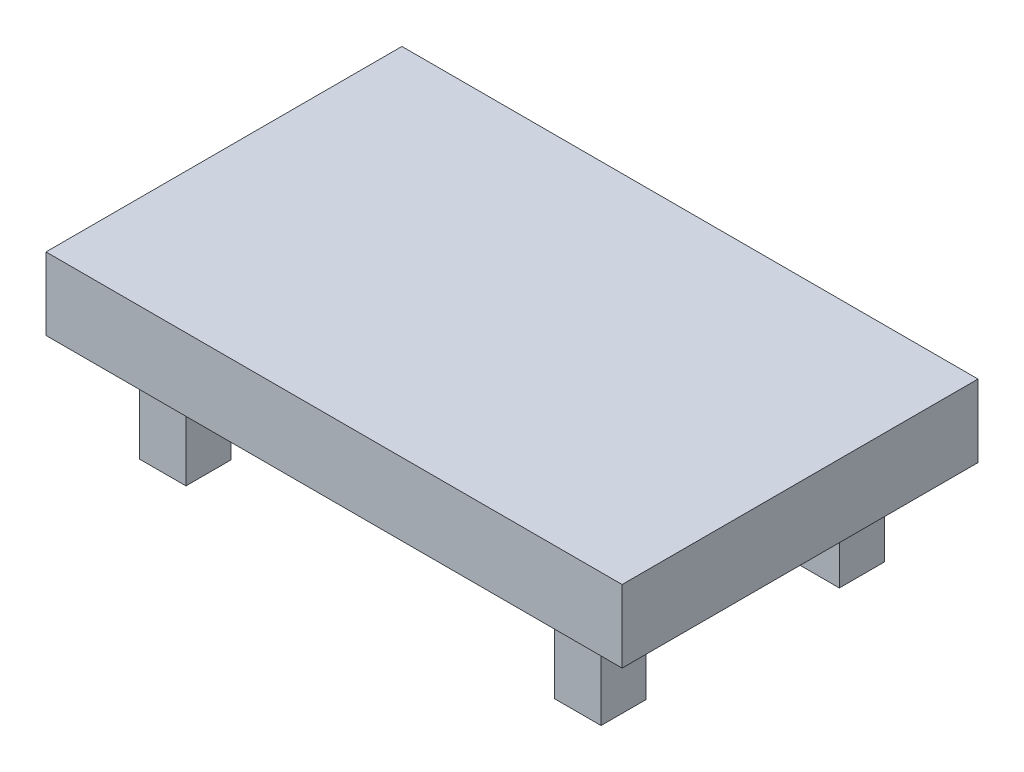
ISO-10303-21;
HEADER;
FILE_DESCRIPTION(('STEP AP214'),'2;1');
FILE_NAME('part.step','',(''),(''),'','','');
FILE_SCHEMA(('AUTOMOTIVE_DESIGN { 1 0 10303 214 1 1 1 1 }'));
ENDSEC;
DATA;
#1=APPLICATION_CONTEXT('core data for automotive mechanical design processes');
#2=APPLICATION_PROTOCOL_DEFINITION('international standard','automotive_design',2000,#1);
#3=PRODUCT_CONTEXT('',#1,'mechanical');
#4=PRODUCT('Part','Part','',(#3));
#5=PRODUCT_RELATED_PRODUCT_CATEGORY('part','',(#4));
#6=PRODUCT_DEFINITION_FORMATION('','',#4);
#7=PRODUCT_DEFINITION_CONTEXT('part definition',#1,'design');
#8=PRODUCT_DEFINITION('design','',#6,#7);
#9=PRODUCT_DEFINITION_SHAPE('','',#8);
#10=(LENGTH_UNIT() NAMED_UNIT(*) SI_UNIT(.MILLI.,.METRE.));
#11=(NAMED_UNIT(*) PLANE_ANGLE_UNIT() SI_UNIT($,.RADIAN.));
#12=(NAMED_UNIT(*) SI_UNIT($,.STERADIAN.) SOLID_ANGLE_UNIT());
#13=UNCERTAINTY_MEASURE_WITH_UNIT(LENGTH_MEASURE(1.E-05),#10,'distance_accuracy_value','');
#14=(GEOMETRIC_REPRESENTATION_CONTEXT(3) GLOBAL_UNCERTAINTY_ASSIGNED_CONTEXT((#13)) GLOBAL_UNIT_ASSIGNED_CONTEXT((#10,
#11,#12)) REPRESENTATION_CONTEXT('',''));
#15=CARTESIAN_POINT('',(0.,0.,0.));
#16=DIRECTION('',(0.,0.,1.));
#17=DIRECTION('',(1.,0.,0.));
#18=AXIS2_PLACEMENT_3D('',#15,#16,#17);
#19=CARTESIAN_POINT('',(-1212.85,0.,749.3));
#20=DIRECTION('',(0.,1.,0.));
#21=DIRECTION('',(0.,0.,1.));
#22=AXIS2_PLACEMENT_3D('',#19,#20,#21);
#23=PLANE('',#22);
#24=DIRECTION('',(1.,0.,0.));
#25=VECTOR('',#24,1.);
#26=CARTESIAN_POINT('',(-971.744914866313,0.,-596.811642704917));
#27=LINE('',#26,#25);
#28=CARTESIAN_POINT('',(-971.744914866313,0.,-596.811642704917));
#29=VERTEX_POINT('',#28);
#30=CARTESIAN_POINT('',(-776.047224743795,0.,-596.811642704917));
#31=VERTEX_POINT('',#30);
#32=EDGE_CURVE('E191',#29,#31,#27,.T.);
#33=ORIENTED_EDGE('',*,*,#32,.F.);
#34=DIRECTION('',(0.,0.,-1.));
#35=VECTOR('',#34,1.);
#36=CARTESIAN_POINT('',(-971.744914866313,0.,-596.811642704917));
#37=LINE('',#36,#35);
#38=CARTESIAN_POINT('',(-971.744914866313,0.,-406.610663860747));
#39=VERTEX_POINT('',#38);
#40=EDGE_CURVE('E204',#39,#29,#37,.T.);
#41=ORIENTED_EDGE('',*,*,#40,.F.);
#42=DIRECTION('',(-1.,0.,0.));
#43=VECTOR('',#42,1.);
#44=CARTESIAN_POINT('',(-971.744914866313,0.,-406.610663860747));
#45=LINE('',#44,#43);
#46=CARTESIAN_POINT('',(-776.047224743795,0.,-406.610663860748));
#47=VERTEX_POINT('',#46);
#48=EDGE_CURVE('E213',#47,#39,#45,.T.);
#49=ORIENTED_EDGE('',*,*,#48,.F.);
#50=DIRECTION('',(0.,0.,1.));
#51=VECTOR('',#50,1.);
#52=CARTESIAN_POINT('',(-776.047224743795,0.,-596.811642704917));
#53=LINE('',#52,#51);
#54=EDGE_CURVE('E194',#31,#47,#53,.T.);
#55=ORIENTED_EDGE('',*,*,#54,.F.);
#56=EDGE_LOOP('',(#33,#41,#49,#55));
#57=FACE_BOUND('',#56,.T.);
#58=DIRECTION('',(0.,0.,-1.));
#59=VECTOR('',#58,1.);
#60=CARTESIAN_POINT('',(-971.744914866313,0.,596.811642704916));
#61=LINE('',#60,#59);
#62=CARTESIAN_POINT('',(-971.744914866313,0.,596.811642704916));
#63=VERTEX_POINT('',#62);
#64=CARTESIAN_POINT('',(-971.744914866313,0.,406.610663860747));
#65=VERTEX_POINT('',#64);
#66=EDGE_CURVE('E262',#63,#65,#61,.T.);
#67=ORIENTED_EDGE('',*,*,#66,.F.);
#68=DIRECTION('',(-1.,0.,0.));
#69=VECTOR('',#68,1.);
#70=CARTESIAN_POINT('',(-971.744914866313,0.,596.811642704916));
#71=LINE('',#70,#69);
#72=CARTESIAN_POINT('',(-776.047224743795,0.,596.811642704916));
#73=VERTEX_POINT('',#72);
#74=EDGE_CURVE('E267',#73,#63,#71,.T.);
#75=ORIENTED_EDGE('',*,*,#74,.F.);
#76=DIRECTION('',(0.,0.,1.));
#77=VECTOR('',#76,1.);
#78=CARTESIAN_POINT('',(-776.047224743795,0.,596.811642704916));
#79=LINE('',#78,#77);
#80=CARTESIAN_POINT('',(-776.047224743795,0.,406.610663860747));
#81=VERTEX_POINT('',#80);
#82=EDGE_CURVE('E279',#81,#73,#79,.T.);
#83=ORIENTED_EDGE('',*,*,#82,.F.);
#84=DIRECTION('',(1.,0.,0.));
#85=VECTOR('',#84,1.);
#86=CARTESIAN_POINT('',(-971.744914866313,0.,406.610663860747));
#87=LINE('',#86,#85);
#88=EDGE_CURVE('E276',#65,#81,#87,.T.);
#89=ORIENTED_EDGE('',*,*,#88,.F.);
#90=EDGE_LOOP('',(#67,#75,#83,#89));
#91=FACE_BOUND('',#90,.T.);
#92=DIRECTION('',(0.,0.,1.));
#93=VECTOR('',#92,1.);
#94=CARTESIAN_POINT('',(-1212.85,0.,-749.3));
#95=LINE('',#94,#93);
#96=CARTESIAN_POINT('',(-1212.85,0.,-749.3));
#97=VERTEX_POINT('',#96);
#98=CARTESIAN_POINT('',(-1212.85,0.,749.3));
#99=VERTEX_POINT('',#98);
#100=EDGE_CURVE('E295',#97,#99,#95,.T.);
#101=ORIENTED_EDGE('',*,*,#100,.F.);
#102=DIRECTION('',(-1.,0.,0.));
#103=VECTOR('',#102,1.);
#104=CARTESIAN_POINT('',(-1212.85,0.,-749.3));
#105=LINE('',#104,#103);
#106=CARTESIAN_POINT('',(1212.85,0.,-749.3));
#107=VERTEX_POINT('',#106);
#108=EDGE_CURVE('E300',#107,#97,#105,.T.);
#109=ORIENTED_EDGE('',*,*,#108,.F.);
#110=DIRECTION('',(0.,0.,-1.));
#111=VECTOR('',#110,1.);
#112=CARTESIAN_POINT('',(1212.85,0.,-749.3));
#113=LINE('',#112,#111);
#114=CARTESIAN_POINT('',(1212.85,0.,749.3));
#115=VERTEX_POINT('',#114);
#116=EDGE_CURVE('E311',#115,#107,#113,.T.);
#117=ORIENTED_EDGE('',*,*,#116,.F.);
#118=DIRECTION('',(1.,0.,0.));
#119=VECTOR('',#118,1.);
#120=CARTESIAN_POINT('',(-1212.85,0.,749.3));
#121=LINE('',#120,#119);
#122=EDGE_CURVE('E309',#99,#115,#121,.T.);
#123=ORIENTED_EDGE('',*,*,#122,.F.);
#124=EDGE_LOOP('',(#101,#109,#117,#123));
#125=FACE_BOUND('',#124,.T.);
#126=DIRECTION('',(-1.,0.,0.));
#127=VECTOR('',#126,1.);
#128=CARTESIAN_POINT('',(971.744914866313,0.,596.811642704916));
#129=LINE('',#128,#127);
#130=CARTESIAN_POINT('',(971.744914866313,0.,596.811642704916));
#131=VERTEX_POINT('',#130);
#132=CARTESIAN_POINT('',(776.047224743795,0.,596.811642704916));
#133=VERTEX_POINT('',#132);
#134=EDGE_CURVE('E229',#131,#133,#129,.T.);
#135=ORIENTED_EDGE('',*,*,#134,.F.);
#136=DIRECTION('',(0.,0.,1.));
#137=VECTOR('',#136,1.);
#138=CARTESIAN_POINT('',(971.744914866313,0.,596.811642704916));
#139=LINE('',#138,#137);
#140=CARTESIAN_POINT('',(971.744914866314,0.,406.610663860747));
#141=VERTEX_POINT('',#140);
#142=EDGE_CURVE('E234',#141,#131,#139,.T.);
#143=ORIENTED_EDGE('',*,*,#142,.F.);
#144=DIRECTION('',(1.,0.,0.));
#145=VECTOR('',#144,1.);
#146=CARTESIAN_POINT('',(971.744914866314,0.,406.610663860747));
#147=LINE('',#146,#145);
#148=CARTESIAN_POINT('',(776.047224743795,0.,406.610663860747));
#149=VERTEX_POINT('',#148);
#150=EDGE_CURVE('E246',#149,#141,#147,.T.);
#151=ORIENTED_EDGE('',*,*,#150,.F.);
#152=DIRECTION('',(0.,0.,-1.));
#153=VECTOR('',#152,1.);
#154=CARTESIAN_POINT('',(776.047224743795,0.,596.811642704916));
#155=LINE('',#154,#153);
#156=EDGE_CURVE('E243',#133,#149,#155,.T.);
#157=ORIENTED_EDGE('',*,*,#156,.F.);
#158=EDGE_LOOP('',(#135,#143,#151,#157));
#159=FACE_BOUND('',#158,.T.);
#160=DIRECTION('',(0.,0.,1.));
#161=VECTOR('',#160,1.);
#162=CARTESIAN_POINT('',(971.744914866313,0.,-596.811642704917));
#163=LINE('',#162,#161);
#164=CARTESIAN_POINT('',(971.744914866313,0.,-596.811642704917));
#165=VERTEX_POINT('',#164);
#166=CARTESIAN_POINT('',(971.744914866313,0.,-406.610663860747));
#167=VERTEX_POINT('',#166);
#168=EDGE_CURVE('E190',#165,#167,#163,.T.);
#169=ORIENTED_EDGE('',*,*,#168,.F.);
#170=DIRECTION('',(1.,0.,0.));
#171=VECTOR('',#170,1.);
#172=CARTESIAN_POINT('',(971.744914866313,0.,-596.811642704917));
#173=LINE('',#172,#171);
#174=CARTESIAN_POINT('',(776.047224743795,0.,-596.811642704917));
#175=VERTEX_POINT('',#174);
#176=EDGE_CURVE('E187',#175,#165,#173,.T.);
#177=ORIENTED_EDGE('',*,*,#176,.F.);
#178=DIRECTION('',(0.,0.,-1.));
#179=VECTOR('',#178,1.);
#180=CARTESIAN_POINT('',(776.047224743795,0.,-596.811642704917));
#181=LINE('',#180,#179);
#182=CARTESIAN_POINT('',(776.047224743795,0.,-406.610663860748));
#183=VERTEX_POINT('',#182);
#184=EDGE_CURVE('E53',#183,#175,#181,.T.);
#185=ORIENTED_EDGE('',*,*,#184,.F.);
#186=DIRECTION('',(-1.,0.,0.));
#187=VECTOR('',#186,1.);
#188=CARTESIAN_POINT('',(971.744914866314,0.,-406.610663860747));
#189=LINE('',#188,#187);
#190=EDGE_CURVE('E48',#167,#183,#189,.T.);
#191=ORIENTED_EDGE('',*,*,#190,.F.);
#192=EDGE_LOOP('',(#169,#177,#185,#191));
#193=FACE_BOUND('',#192,.T.);
#194=ADVANCED_FACE('F33',(#57,#91,#125,#159,#193),#23,.F.);
#195=CARTESIAN_POINT('',(-1212.85,304.8,-749.3));
#196=DIRECTION('',(1.,0.,0.));
#197=DIRECTION('',(0.,0.,-1.));
#198=AXIS2_PLACEMENT_3D('',#195,#196,#197);
#199=PLANE('',#198);
#200=ORIENTED_EDGE('',*,*,#100,.T.);
#201=DIRECTION('',(0.,-1.,0.));
#202=VECTOR('',#201,1.);
#203=CARTESIAN_POINT('',(-1212.85,304.8,749.3));
#204=LINE('',#203,#202);
#205=CARTESIAN_POINT('',(-1212.85,304.8,749.3));
#206=VERTEX_POINT('',#205);
#207=EDGE_CURVE('E11',#206,#99,#204,.T.);
#208=ORIENTED_EDGE('',*,*,#207,.F.);
#209=DIRECTION('',(0.,0.,1.));
#210=VECTOR('',#209,1.);
#211=CARTESIAN_POINT('',(-1212.85,304.8,-749.3));
#212=LINE('',#211,#210);
#213=CARTESIAN_POINT('',(-1212.85,304.8,-749.3));
#214=VERTEX_POINT('',#213);
#215=EDGE_CURVE('E296',#214,#206,#212,.T.);
#216=ORIENTED_EDGE('',*,*,#215,.F.);
#217=DIRECTION('',(0.,-1.,0.));
#218=VECTOR('',#217,1.);
#219=CARTESIAN_POINT('',(-1212.85,304.8,-749.3));
#220=LINE('',#219,#218);
#221=EDGE_CURVE('E306',#214,#97,#220,.T.);
#222=ORIENTED_EDGE('',*,*,#221,.T.);
#223=EDGE_LOOP('',(#200,#208,#216,#222));
#224=FACE_BOUND('',#223,.T.);
#225=ADVANCED_FACE('F35',(#224),#199,.F.);
#226=CARTESIAN_POINT('',(-1212.85,304.8,749.3));
#227=DIRECTION('',(0.,0.,-1.));
#228=DIRECTION('',(-1.,0.,0.));
#229=AXIS2_PLACEMENT_3D('',#226,#227,#228);
#230=PLANE('',#229);
#231=ORIENTED_EDGE('',*,*,#122,.T.);
#232=DIRECTION('',(0.,-1.,0.));
#233=VECTOR('',#232,1.);
#234=CARTESIAN_POINT('',(1212.85,304.8,749.3));
#235=LINE('',#234,#233);
#236=CARTESIAN_POINT('',(1212.85,304.8,749.3));
#237=VERTEX_POINT('',#236);
#238=EDGE_CURVE('E41',#237,#115,#235,.T.);
#239=ORIENTED_EDGE('',*,*,#238,.F.);
#240=DIRECTION('',(1.,0.,0.));
#241=VECTOR('',#240,1.);
#242=CARTESIAN_POINT('',(-1212.85,304.8,749.3));
#243=LINE('',#242,#241);
#244=EDGE_CURVE('E299',#206,#237,#243,.T.);
#245=ORIENTED_EDGE('',*,*,#244,.F.);
#246=ORIENTED_EDGE('',*,*,#207,.T.);
#247=EDGE_LOOP('',(#231,#239,#245,#246));
#248=FACE_BOUND('',#247,.T.);
#249=ADVANCED_FACE('F339',(#248),#230,.F.);
#250=CARTESIAN_POINT('',(1212.85,304.8,-749.3));
#251=DIRECTION('',(-1.,0.,0.));
#252=DIRECTION('',(0.,0.,1.));
#253=AXIS2_PLACEMENT_3D('',#250,#251,#252);
#254=PLANE('',#253);
#255=ORIENTED_EDGE('',*,*,#116,.T.);
#256=DIRECTION('',(0.,-1.,0.));
#257=VECTOR('',#256,1.);
#258=CARTESIAN_POINT('',(1212.85,304.8,-749.3));
#259=LINE('',#258,#257);
#260=CARTESIAN_POINT('',(1212.85,304.8,-749.3));
#261=VERTEX_POINT('',#260);
#262=EDGE_CURVE('E316',#261,#107,#259,.T.);
#263=ORIENTED_EDGE('',*,*,#262,.F.);
#264=DIRECTION('',(0.,0.,-1.));
#265=VECTOR('',#264,1.);
#266=CARTESIAN_POINT('',(1212.85,304.8,-749.3));
#267=LINE('',#266,#265);
#268=EDGE_CURVE('E302',#237,#261,#267,.T.);
#269=ORIENTED_EDGE('',*,*,#268,.F.);
#270=ORIENTED_EDGE('',*,*,#238,.T.);
#271=EDGE_LOOP('',(#255,#263,#269,#270));
#272=FACE_BOUND('',#271,.T.);
#273=ADVANCED_FACE('F323',(#272),#254,.F.);
#274=CARTESIAN_POINT('',(-1212.85,304.8,-749.3));
#275=DIRECTION('',(0.,0.,1.));
#276=DIRECTION('',(1.,0.,0.));
#277=AXIS2_PLACEMENT_3D('',#274,#275,#276);
#278=PLANE('',#277);
#279=ORIENTED_EDGE('',*,*,#108,.T.);
#280=ORIENTED_EDGE('',*,*,#221,.F.);
#281=DIRECTION('',(-1.,0.,0.));
#282=VECTOR('',#281,1.);
#283=CARTESIAN_POINT('',(-1212.85,304.8,-749.3));
#284=LINE('',#283,#282);
#285=EDGE_CURVE('E304',#261,#214,#284,.T.);
#286=ORIENTED_EDGE('',*,*,#285,.F.);
#287=ORIENTED_EDGE('',*,*,#262,.T.);
#288=EDGE_LOOP('',(#279,#280,#286,#287));
#289=FACE_BOUND('',#288,.T.);
#290=ADVANCED_FACE('F332',(#289),#278,.F.);
#291=CARTESIAN_POINT('',(-1212.85,304.8,749.3));
#292=DIRECTION('',(0.,1.,0.));
#293=DIRECTION('',(0.,0.,1.));
#294=AXIS2_PLACEMENT_3D('',#291,#292,#293);
#295=PLANE('',#294);
#296=ORIENTED_EDGE('',*,*,#215,.T.);
#297=ORIENTED_EDGE('',*,*,#244,.T.);
#298=ORIENTED_EDGE('',*,*,#268,.T.);
#299=ORIENTED_EDGE('',*,*,#285,.T.);
#300=EDGE_LOOP('',(#296,#297,#298,#299));
#301=FACE_BOUND('',#300,.T.);
#302=ADVANCED_FACE('F338',(#301),#295,.T.);
#303=CARTESIAN_POINT('',(-971.744914866313,-406.4,596.811642704916));
#304=DIRECTION('',(1.,0.,0.));
#305=DIRECTION('',(0.,0.,-1.));
#306=AXIS2_PLACEMENT_3D('',#303,#304,#305);
#307=PLANE('',#306);
#308=ORIENTED_EDGE('',*,*,#66,.T.);
#309=DIRECTION('',(0.,1.,0.));
#310=VECTOR('',#309,1.);
#311=CARTESIAN_POINT('',(-971.744914866313,-406.4,406.610663860747));
#312=LINE('',#311,#310);
#313=CARTESIAN_POINT('',(-971.744914866313,-406.4,406.610663860747));
#314=VERTEX_POINT('',#313);
#315=EDGE_CURVE('E292',#314,#65,#312,.T.);
#316=ORIENTED_EDGE('',*,*,#315,.F.);
#317=DIRECTION('',(0.,0.,-1.));
#318=VECTOR('',#317,1.);
#319=CARTESIAN_POINT('',(-971.744914866313,-406.4,596.811642704916));
#320=LINE('',#319,#318);
#321=CARTESIAN_POINT('',(-971.744914866313,-406.4,596.811642704916));
#322=VERTEX_POINT('',#321);
#323=EDGE_CURVE('E263',#322,#314,#320,.T.);
#324=ORIENTED_EDGE('',*,*,#323,.F.);
#325=DIRECTION('',(0.,1.,0.));
#326=VECTOR('',#325,1.);
#327=CARTESIAN_POINT('',(-971.744914866313,-406.4,596.811642704916));
#328=LINE('',#327,#326);
#329=EDGE_CURVE('E273',#322,#63,#328,.T.);
#330=ORIENTED_EDGE('',*,*,#329,.T.);
#331=EDGE_LOOP('',(#308,#316,#324,#330));
#332=FACE_BOUND('',#331,.T.);
#333=ADVANCED_FACE('F359',(#332),#307,.F.);
#334=CARTESIAN_POINT('',(-971.744914866313,-406.4,406.610663860747));
#335=DIRECTION('',(0.,0.,1.));
#336=DIRECTION('',(1.,0.,0.));
#337=AXIS2_PLACEMENT_3D('',#334,#335,#336);
#338=PLANE('',#337);
#339=ORIENTED_EDGE('',*,*,#88,.T.);
#340=DIRECTION('',(0.,1.,0.));
#341=VECTOR('',#340,1.);
#342=CARTESIAN_POINT('',(-776.047224743795,-406.4,406.610663860747));
#343=LINE('',#342,#341);
#344=CARTESIAN_POINT('',(-776.047224743795,-406.4,406.610663860747));
#345=VERTEX_POINT('',#344);
#346=EDGE_CURVE('E289',#345,#81,#343,.T.);
#347=ORIENTED_EDGE('',*,*,#346,.F.);
#348=DIRECTION('',(1.,0.,0.));
#349=VECTOR('',#348,1.);
#350=CARTESIAN_POINT('',(-971.744914866313,-406.4,406.610663860747));
#351=LINE('',#350,#349);
#352=EDGE_CURVE('E266',#314,#345,#351,.T.);
#353=ORIENTED_EDGE('',*,*,#352,.F.);
#354=ORIENTED_EDGE('',*,*,#315,.T.);
#355=EDGE_LOOP('',(#339,#347,#353,#354));
#356=FACE_BOUND('',#355,.T.);
#357=ADVANCED_FACE('F363',(#356),#338,.F.);
#358=CARTESIAN_POINT('',(-776.047224743795,-406.4,596.811642704916));
#359=DIRECTION('',(-1.,0.,0.));
#360=DIRECTION('',(0.,0.,1.));
#361=AXIS2_PLACEMENT_3D('',#358,#359,#360);
#362=PLANE('',#361);
#363=ORIENTED_EDGE('',*,*,#82,.T.);
#364=DIRECTION('',(0.,1.,0.));
#365=VECTOR('',#364,1.);
#366=CARTESIAN_POINT('',(-776.047224743795,-406.4,596.811642704916));
#367=LINE('',#366,#365);
#368=CARTESIAN_POINT('',(-776.047224743795,-406.4,596.811642704916));
#369=VERTEX_POINT('',#368);
#370=EDGE_CURVE('E286',#369,#73,#367,.T.);
#371=ORIENTED_EDGE('',*,*,#370,.F.);
#372=DIRECTION('',(0.,0.,1.));
#373=VECTOR('',#372,1.);
#374=CARTESIAN_POINT('',(-776.047224743795,-406.4,596.811642704916));
#375=LINE('',#374,#373);
#376=EDGE_CURVE('E269',#345,#369,#375,.T.);
#377=ORIENTED_EDGE('',*,*,#376,.F.);
#378=ORIENTED_EDGE('',*,*,#346,.T.);
#379=EDGE_LOOP('',(#363,#371,#377,#378));
#380=FACE_BOUND('',#379,.T.);
#381=ADVANCED_FACE('F368',(#380),#362,.F.);
#382=CARTESIAN_POINT('',(-971.744914866313,-406.4,596.811642704916));
#383=DIRECTION('',(0.,0.,-1.));
#384=DIRECTION('',(-1.,0.,0.));
#385=AXIS2_PLACEMENT_3D('',#382,#383,#384);
#386=PLANE('',#385);
#387=ORIENTED_EDGE('',*,*,#74,.T.);
#388=ORIENTED_EDGE('',*,*,#329,.F.);
#389=DIRECTION('',(-1.,0.,0.));
#390=VECTOR('',#389,1.);
#391=CARTESIAN_POINT('',(-971.744914866313,-406.4,596.811642704916));
#392=LINE('',#391,#390);
#393=EDGE_CURVE('E271',#369,#322,#392,.T.);
#394=ORIENTED_EDGE('',*,*,#393,.F.);
#395=ORIENTED_EDGE('',*,*,#370,.T.);
#396=EDGE_LOOP('',(#387,#388,#394,#395));
#397=FACE_BOUND('',#396,.T.);
#398=ADVANCED_FACE('F374',(#397),#386,.F.);
#399=CARTESIAN_POINT('',(-971.744914866313,-406.4,406.610663860747));
#400=DIRECTION('',(0.,-1.,0.));
#401=DIRECTION('',(0.,0.,-1.));
#402=AXIS2_PLACEMENT_3D('',#399,#400,#401);
#403=PLANE('',#402);
#404=ORIENTED_EDGE('',*,*,#323,.T.);
#405=ORIENTED_EDGE('',*,*,#352,.T.);
#406=ORIENTED_EDGE('',*,*,#376,.T.);
#407=ORIENTED_EDGE('',*,*,#393,.T.);
#408=EDGE_LOOP('',(#404,#405,#406,#407));
#409=FACE_BOUND('',#408,.T.);
#410=ADVANCED_FACE('F378',(#409),#403,.T.);
#411=CARTESIAN_POINT('',(971.744914866313,-406.4,596.811642704916));
#412=DIRECTION('',(0.,0.,-1.));
#413=DIRECTION('',(-1.,0.,0.));
#414=AXIS2_PLACEMENT_3D('',#411,#412,#413);
#415=PLANE('',#414);
#416=ORIENTED_EDGE('',*,*,#134,.T.);
#417=DIRECTION('',(0.,1.,0.));
#418=VECTOR('',#417,1.);
#419=CARTESIAN_POINT('',(776.047224743795,-406.4,596.811642704916));
#420=LINE('',#419,#418);
#421=CARTESIAN_POINT('',(776.047224743795,-406.4,596.811642704916));
#422=VERTEX_POINT('',#421);
#423=EDGE_CURVE('E259',#422,#133,#420,.T.);
#424=ORIENTED_EDGE('',*,*,#423,.F.);
#425=DIRECTION('',(-1.,0.,0.));
#426=VECTOR('',#425,1.);
#427=CARTESIAN_POINT('',(971.744914866313,-406.4,596.811642704916));
#428=LINE('',#427,#426);
#429=CARTESIAN_POINT('',(971.744914866313,-406.4,596.811642704916));
#430=VERTEX_POINT('',#429);
#431=EDGE_CURVE('E230',#430,#422,#428,.T.);
#432=ORIENTED_EDGE('',*,*,#431,.F.);
#433=DIRECTION('',(0.,1.,0.));
#434=VECTOR('',#433,1.);
#435=CARTESIAN_POINT('',(971.744914866313,-406.4,596.811642704916));
#436=LINE('',#435,#434);
#437=EDGE_CURVE('E240',#430,#131,#436,.T.);
#438=ORIENTED_EDGE('',*,*,#437,.T.);
#439=EDGE_LOOP('',(#416,#424,#432,#438));
#440=FACE_BOUND('',#439,.T.);
#441=ADVANCED_FACE('F382',(#440),#415,.F.);
#442=CARTESIAN_POINT('',(776.047224743795,-406.4,596.811642704916));
#443=DIRECTION('',(1.,0.,0.));
#444=DIRECTION('',(0.,0.,-1.));
#445=AXIS2_PLACEMENT_3D('',#442,#443,#444);
#446=PLANE('',#445);
#447=ORIENTED_EDGE('',*,*,#156,.T.);
#448=DIRECTION('',(0.,1.,0.));
#449=VECTOR('',#448,1.);
#450=CARTESIAN_POINT('',(776.047224743795,-406.4,406.610663860747));
#451=LINE('',#450,#449);
#452=CARTESIAN_POINT('',(776.047224743795,-406.4,406.610663860747));
#453=VERTEX_POINT('',#452);
#454=EDGE_CURVE('E256',#453,#149,#451,.T.);
#455=ORIENTED_EDGE('',*,*,#454,.F.);
#456=DIRECTION('',(0.,0.,-1.));
#457=VECTOR('',#456,1.);
#458=CARTESIAN_POINT('',(776.047224743795,-406.4,596.811642704916));
#459=LINE('',#458,#457);
#460=EDGE_CURVE('E233',#422,#453,#459,.T.);
#461=ORIENTED_EDGE('',*,*,#460,.F.);
#462=ORIENTED_EDGE('',*,*,#423,.T.);
#463=EDGE_LOOP('',(#447,#455,#461,#462));
#464=FACE_BOUND('',#463,.T.);
#465=ADVANCED_FACE('F386',(#464),#446,.F.);
#466=CARTESIAN_POINT('',(971.744914866314,-406.4,406.610663860747));
#467=DIRECTION('',(0.,0.,1.));
#468=DIRECTION('',(1.,0.,0.));
#469=AXIS2_PLACEMENT_3D('',#466,#467,#468);
#470=PLANE('',#469);
#471=ORIENTED_EDGE('',*,*,#150,.T.);
#472=DIRECTION('',(0.,1.,0.));
#473=VECTOR('',#472,1.);
#474=CARTESIAN_POINT('',(971.744914866314,-406.4,406.610663860747));
#475=LINE('',#474,#473);
#476=CARTESIAN_POINT('',(971.744914866314,-406.4,406.610663860747));
#477=VERTEX_POINT('',#476);
#478=EDGE_CURVE('E253',#477,#141,#475,.T.);
#479=ORIENTED_EDGE('',*,*,#478,.F.);
#480=DIRECTION('',(1.,0.,0.));
#481=VECTOR('',#480,1.);
#482=CARTESIAN_POINT('',(971.744914866314,-406.4,406.610663860747));
#483=LINE('',#482,#481);
#484=EDGE_CURVE('E236',#453,#477,#483,.T.);
#485=ORIENTED_EDGE('',*,*,#484,.F.);
#486=ORIENTED_EDGE('',*,*,#454,.T.);
#487=EDGE_LOOP('',(#471,#479,#485,#486));
#488=FACE_BOUND('',#487,.T.);
#489=ADVANCED_FACE('F390',(#488),#470,.F.);
#490=CARTESIAN_POINT('',(971.744914866313,-406.4,596.811642704916));
#491=DIRECTION('',(-1.,0.,0.));
#492=DIRECTION('',(0.,0.,1.));
#493=AXIS2_PLACEMENT_3D('',#490,#491,#492);
#494=PLANE('',#493);
#495=ORIENTED_EDGE('',*,*,#142,.T.);
#496=ORIENTED_EDGE('',*,*,#437,.F.);
#497=DIRECTION('',(0.,0.,1.));
#498=VECTOR('',#497,1.);
#499=CARTESIAN_POINT('',(971.744914866313,-406.4,596.811642704916));
#500=LINE('',#499,#498);
#501=EDGE_CURVE('E238',#477,#430,#500,.T.);
#502=ORIENTED_EDGE('',*,*,#501,.F.);
#503=ORIENTED_EDGE('',*,*,#478,.T.);
#504=EDGE_LOOP('',(#495,#496,#502,#503));
#505=FACE_BOUND('',#504,.T.);
#506=ADVANCED_FACE('F394',(#505),#494,.F.);
#507=CARTESIAN_POINT('',(776.047224743795,-406.4,596.811642704916));
#508=DIRECTION('',(0.,-1.,0.));
#509=DIRECTION('',(0.,0.,-1.));
#510=AXIS2_PLACEMENT_3D('',#507,#508,#509);
#511=PLANE('',#510);
#512=ORIENTED_EDGE('',*,*,#431,.T.);
#513=ORIENTED_EDGE('',*,*,#460,.T.);
#514=ORIENTED_EDGE('',*,*,#484,.T.);
#515=ORIENTED_EDGE('',*,*,#501,.T.);
#516=EDGE_LOOP('',(#512,#513,#514,#515));
#517=FACE_BOUND('',#516,.T.);
#518=ADVANCED_FACE('F398',(#517),#511,.T.);
#519=CARTESIAN_POINT('',(-971.744914866313,-406.4,-596.811642704917));
#520=DIRECTION('',(0.,0.,1.));
#521=DIRECTION('',(1.,0.,0.));
#522=AXIS2_PLACEMENT_3D('',#519,#520,#521);
#523=PLANE('',#522);
#524=ORIENTED_EDGE('',*,*,#32,.T.);
#525=DIRECTION('',(0.,1.,0.));
#526=VECTOR('',#525,1.);
#527=CARTESIAN_POINT('',(-776.047224743795,-406.4,-596.811642704917));
#528=LINE('',#527,#526);
#529=CARTESIAN_POINT('',(-776.047224743795,-406.4,-596.811642704917));
#530=VERTEX_POINT('',#529);
#531=EDGE_CURVE('E226',#530,#31,#528,.T.);
#532=ORIENTED_EDGE('',*,*,#531,.F.);
#533=DIRECTION('',(1.,0.,0.));
#534=VECTOR('',#533,1.);
#535=CARTESIAN_POINT('',(-971.744914866313,-406.4,-596.811642704917));
#536=LINE('',#535,#534);
#537=CARTESIAN_POINT('',(-971.744914866313,-406.4,-596.811642704917));
#538=VERTEX_POINT('',#537);
#539=EDGE_CURVE('E200',#538,#530,#536,.T.);
#540=ORIENTED_EDGE('',*,*,#539,.F.);
#541=DIRECTION('',(0.,1.,0.));
#542=VECTOR('',#541,1.);
#543=CARTESIAN_POINT('',(-971.744914866313,-406.4,-596.811642704917));
#544=LINE('',#543,#542);
#545=EDGE_CURVE('E209',#538,#29,#544,.T.);
#546=ORIENTED_EDGE('',*,*,#545,.T.);
#547=EDGE_LOOP('',(#524,#532,#540,#546));
#548=FACE_BOUND('',#547,.T.);
#549=ADVANCED_FACE('F402',(#548),#523,.F.);
#550=CARTESIAN_POINT('',(-776.047224743795,-406.4,-596.811642704917));
#551=DIRECTION('',(-1.,0.,0.));
#552=DIRECTION('',(0.,0.,1.));
#553=AXIS2_PLACEMENT_3D('',#550,#551,#552);
#554=PLANE('',#553);
#555=ORIENTED_EDGE('',*,*,#54,.T.);
#556=DIRECTION('',(0.,1.,0.));
#557=VECTOR('',#556,1.);
#558=CARTESIAN_POINT('',(-776.047224743795,-406.4,-406.610663860748));
#559=LINE('',#558,#557);
#560=CARTESIAN_POINT('',(-776.047224743795,-406.4,-406.610663860748));
#561=VERTEX_POINT('',#560);
#562=EDGE_CURVE('E223',#561,#47,#559,.T.);
#563=ORIENTED_EDGE('',*,*,#562,.F.);
#564=DIRECTION('',(0.,0.,1.));
#565=VECTOR('',#564,1.);
#566=CARTESIAN_POINT('',(-776.047224743795,-406.4,-596.811642704917));
#567=LINE('',#566,#565);
#568=EDGE_CURVE('E203',#530,#561,#567,.T.);
#569=ORIENTED_EDGE('',*,*,#568,.F.);
#570=ORIENTED_EDGE('',*,*,#531,.T.);
#571=EDGE_LOOP('',(#555,#563,#569,#570));
#572=FACE_BOUND('',#571,.T.);
#573=ADVANCED_FACE('F406',(#572),#554,.F.);
#574=CARTESIAN_POINT('',(-971.744914866313,-406.4,-406.610663860747));
#575=DIRECTION('',(0.,0.,-1.));
#576=DIRECTION('',(-1.,0.,0.));
#577=AXIS2_PLACEMENT_3D('',#574,#575,#576);
#578=PLANE('',#577);
#579=ORIENTED_EDGE('',*,*,#48,.T.);
#580=DIRECTION('',(0.,1.,0.));
#581=VECTOR('',#580,1.);
#582=CARTESIAN_POINT('',(-971.744914866313,-406.4,-406.610663860747));
#583=LINE('',#582,#581);
#584=CARTESIAN_POINT('',(-971.744914866313,-406.4,-406.610663860747));
#585=VERTEX_POINT('',#584);
#586=EDGE_CURVE('E220',#585,#39,#583,.T.);
#587=ORIENTED_EDGE('',*,*,#586,.F.);
#588=DIRECTION('',(-1.,0.,0.));
#589=VECTOR('',#588,1.);
#590=CARTESIAN_POINT('',(-971.744914866313,-406.4,-406.610663860747));
#591=LINE('',#590,#589);
#592=EDGE_CURVE('E206',#561,#585,#591,.T.);
#593=ORIENTED_EDGE('',*,*,#592,.F.);
#594=ORIENTED_EDGE('',*,*,#562,.T.);
#595=EDGE_LOOP('',(#579,#587,#593,#594));
#596=FACE_BOUND('',#595,.T.);
#597=ADVANCED_FACE('F410',(#596),#578,.F.);
#598=CARTESIAN_POINT('',(-971.744914866313,-406.4,-596.811642704917));
#599=DIRECTION('',(1.,0.,0.));
#600=DIRECTION('',(0.,0.,-1.));
#601=AXIS2_PLACEMENT_3D('',#598,#599,#600);
#602=PLANE('',#601);
#603=ORIENTED_EDGE('',*,*,#40,.T.);
#604=ORIENTED_EDGE('',*,*,#545,.F.);
#605=DIRECTION('',(0.,0.,-1.));
#606=VECTOR('',#605,1.);
#607=CARTESIAN_POINT('',(-971.744914866313,-406.4,-596.811642704917));
#608=LINE('',#607,#606);
#609=EDGE_CURVE('E208',#585,#538,#608,.T.);
#610=ORIENTED_EDGE('',*,*,#609,.F.);
#611=ORIENTED_EDGE('',*,*,#586,.T.);
#612=EDGE_LOOP('',(#603,#604,#610,#611));
#613=FACE_BOUND('',#612,.T.);
#614=ADVANCED_FACE('F414',(#613),#602,.F.);
#615=CARTESIAN_POINT('',(-776.047224743795,-406.4,-596.811642704917));
#616=DIRECTION('',(0.,-1.,0.));
#617=DIRECTION('',(0.,0.,-1.));
#618=AXIS2_PLACEMENT_3D('',#615,#616,#617);
#619=PLANE('',#618);
#620=ORIENTED_EDGE('',*,*,#539,.T.);
#621=ORIENTED_EDGE('',*,*,#568,.T.);
#622=ORIENTED_EDGE('',*,*,#592,.T.);
#623=ORIENTED_EDGE('',*,*,#609,.T.);
#624=EDGE_LOOP('',(#620,#621,#622,#623));
#625=FACE_BOUND('',#624,.T.);
#626=ADVANCED_FACE('F418',(#625),#619,.T.);
#627=CARTESIAN_POINT('',(971.744914866313,-406.4,-596.811642704917));
#628=DIRECTION('',(-1.,0.,0.));
#629=DIRECTION('',(0.,0.,1.));
#630=AXIS2_PLACEMENT_3D('',#627,#628,#629);
#631=PLANE('',#630);
#632=ORIENTED_EDGE('',*,*,#168,.T.);
#633=DIRECTION('',(0.,1.,0.));
#634=VECTOR('',#633,1.);
#635=CARTESIAN_POINT('',(971.744914866314,-406.4,-406.610663860747));
#636=LINE('',#635,#634);
#637=CARTESIAN_POINT('',(971.744914866314,-406.4,-406.610663860747));
#638=VERTEX_POINT('',#637);
#639=EDGE_CURVE('E171',#638,#167,#636,.T.);
#640=ORIENTED_EDGE('',*,*,#639,.F.);
#641=DIRECTION('',(0.,0.,1.));
#642=VECTOR('',#641,1.);
#643=CARTESIAN_POINT('',(971.744914866313,-406.4,-596.811642704917));
#644=LINE('',#643,#642);
#645=CARTESIAN_POINT('',(971.744914866313,-406.4,-596.811642704917));
#646=VERTEX_POINT('',#645);
#647=EDGE_CURVE('E178',#646,#638,#644,.T.);
#648=ORIENTED_EDGE('',*,*,#647,.F.);
#649=DIRECTION('',(0.,1.,0.));
#650=VECTOR('',#649,1.);
#651=CARTESIAN_POINT('',(971.744914866313,-406.4,-596.811642704917));
#652=LINE('',#651,#650);
#653=EDGE_CURVE('E584',#646,#165,#652,.T.);
#654=ORIENTED_EDGE('',*,*,#653,.T.);
#655=EDGE_LOOP('',(#632,#640,#648,#654));
#656=FACE_BOUND('',#655,.T.);
#657=ADVANCED_FACE('F189',(#656),#631,.F.);
#658=CARTESIAN_POINT('',(971.744914866314,-406.4,-406.610663860747));
#659=DIRECTION('',(0.,0.,-1.));
#660=DIRECTION('',(-1.,0.,0.));
#661=AXIS2_PLACEMENT_3D('',#658,#659,#660);
#662=PLANE('',#661);
#663=ORIENTED_EDGE('',*,*,#190,.T.);
#664=DIRECTION('',(0.,1.,0.));
#665=VECTOR('',#664,1.);
#666=CARTESIAN_POINT('',(776.047224743795,-406.4,-406.610663860748));
#667=LINE('',#666,#665);
#668=CARTESIAN_POINT('',(776.047224743795,-406.4,-406.610663860748));
#669=VERTEX_POINT('',#668);
#670=EDGE_CURVE('E174',#669,#183,#667,.T.);
#671=ORIENTED_EDGE('',*,*,#670,.F.);
#672=DIRECTION('',(-1.,0.,0.));
#673=VECTOR('',#672,1.);
#674=CARTESIAN_POINT('',(971.744914866314,-406.4,-406.610663860747));
#675=LINE('',#674,#673);
#676=EDGE_CURVE('E167',#638,#669,#675,.T.);
#677=ORIENTED_EDGE('',*,*,#676,.F.);
#678=ORIENTED_EDGE('',*,*,#639,.T.);
#679=EDGE_LOOP('',(#663,#671,#677,#678));
#680=FACE_BOUND('',#679,.T.);
#681=ADVANCED_FACE('F169',(#680),#662,.F.);
#682=CARTESIAN_POINT('',(776.047224743795,-406.4,-596.811642704917));
#683=DIRECTION('',(1.,0.,0.));
#684=DIRECTION('',(0.,0.,-1.));
#685=AXIS2_PLACEMENT_3D('',#682,#683,#684);
#686=PLANE('',#685);
#687=ORIENTED_EDGE('',*,*,#184,.T.);
#688=DIRECTION('',(0.,1.,0.));
#689=VECTOR('',#688,1.);
#690=CARTESIAN_POINT('',(776.047224743795,-406.4,-596.811642704917));
#691=LINE('',#690,#689);
#692=CARTESIAN_POINT('',(776.047224743795,-406.4,-596.811642704917));
#693=VERTEX_POINT('',#692);
#694=EDGE_CURVE('E196',#693,#175,#691,.T.);
#695=ORIENTED_EDGE('',*,*,#694,.F.);
#696=DIRECTION('',(0.,0.,-1.));
#697=VECTOR('',#696,1.);
#698=CARTESIAN_POINT('',(776.047224743795,-406.4,-596.811642704917));
#699=LINE('',#698,#697);
#700=EDGE_CURVE('E177',#669,#693,#699,.T.);
#701=ORIENTED_EDGE('',*,*,#700,.F.);
#702=ORIENTED_EDGE('',*,*,#670,.T.);
#703=EDGE_LOOP('',(#687,#695,#701,#702));
#704=FACE_BOUND('',#703,.T.);
#705=ADVANCED_FACE('F427',(#704),#686,.F.);
#706=CARTESIAN_POINT('',(971.744914866313,-406.4,-596.811642704917));
#707=DIRECTION('',(0.,0.,1.));
#708=DIRECTION('',(1.,0.,0.));
#709=AXIS2_PLACEMENT_3D('',#706,#707,#708);
#710=PLANE('',#709);
#711=ORIENTED_EDGE('',*,*,#176,.T.);
#712=ORIENTED_EDGE('',*,*,#653,.F.);
#713=DIRECTION('',(1.,0.,0.));
#714=VECTOR('',#713,1.);
#715=CARTESIAN_POINT('',(971.744914866313,-406.4,-596.811642704917));
#716=LINE('',#715,#714);
#717=EDGE_CURVE('E183',#693,#646,#716,.T.);
#718=ORIENTED_EDGE('',*,*,#717,.F.);
#719=ORIENTED_EDGE('',*,*,#694,.T.);
#720=EDGE_LOOP('',(#711,#712,#718,#719));
#721=FACE_BOUND('',#720,.T.);
#722=ADVANCED_FACE('F430',(#721),#710,.F.);
#723=CARTESIAN_POINT('',(971.744914866314,-406.4,-406.610663860747));
#724=DIRECTION('',(0.,-1.,0.));
#725=DIRECTION('',(0.,0.,-1.));
#726=AXIS2_PLACEMENT_3D('',#723,#724,#725);
#727=PLANE('',#726);
#728=ORIENTED_EDGE('',*,*,#647,.T.);
#729=ORIENTED_EDGE('',*,*,#676,.T.);
#730=ORIENTED_EDGE('',*,*,#700,.T.);
#731=ORIENTED_EDGE('',*,*,#717,.T.);
#732=EDGE_LOOP('',(#728,#729,#730,#731));
#733=FACE_BOUND('',#732,.T.);
#734=ADVANCED_FACE('F181',(#733),#727,.T.);
#735=CLOSED_SHELL('',(#194,#225,#249,#273,#290,#302,#333,#357,#381,#398,#410,#441,#465,#489,
#506,#518,#549,#573,#597,#614,#626,#657,#681,#705,#722,#734));
#736=MANIFOLD_SOLID_BREP('B2',#735);
#737=ADVANCED_BREP_SHAPE_REPRESENTATION('',(#18,#736),#14);
#738=SHAPE_DEFINITION_REPRESENTATION(#9,#737);
ENDSEC;
END-ISO-10303-21;
